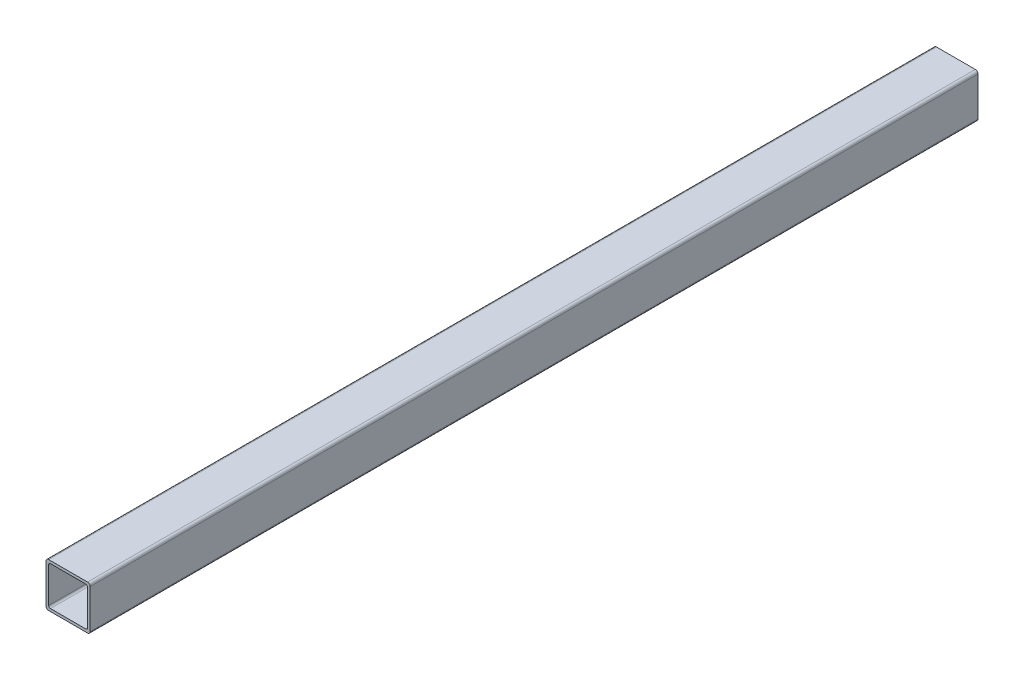
ISO-10303-21;
HEADER;
FILE_DESCRIPTION(('STEP AP214'),'2;1');
FILE_NAME('part.step','',(''),(''),'','','');
FILE_SCHEMA(('AUTOMOTIVE_DESIGN { 1 0 10303 214 1 1 1 1 }'));
ENDSEC;
DATA;
#1=APPLICATION_CONTEXT('core data for automotive mechanical design processes');
#2=APPLICATION_PROTOCOL_DEFINITION('international standard','automotive_design',2000,#1);
#3=PRODUCT_CONTEXT('',#1,'mechanical');
#4=PRODUCT('Part','Part','',(#3));
#5=PRODUCT_RELATED_PRODUCT_CATEGORY('part','',(#4));
#6=PRODUCT_DEFINITION_FORMATION('','',#4);
#7=PRODUCT_DEFINITION_CONTEXT('part definition',#1,'design');
#8=PRODUCT_DEFINITION('design','',#6,#7);
#9=PRODUCT_DEFINITION_SHAPE('','',#8);
#10=(LENGTH_UNIT() NAMED_UNIT(*) SI_UNIT(.MILLI.,.METRE.));
#11=(NAMED_UNIT(*) PLANE_ANGLE_UNIT() SI_UNIT($,.RADIAN.));
#12=(NAMED_UNIT(*) SI_UNIT($,.STERADIAN.) SOLID_ANGLE_UNIT());
#13=UNCERTAINTY_MEASURE_WITH_UNIT(LENGTH_MEASURE(1.E-05),#10,'distance_accuracy_value','');
#14=(GEOMETRIC_REPRESENTATION_CONTEXT(3) GLOBAL_UNCERTAINTY_ASSIGNED_CONTEXT((#13)) GLOBAL_UNIT_ASSIGNED_CONTEXT((#10,
#11,#12)) REPRESENTATION_CONTEXT('',''));
#15=CARTESIAN_POINT('',(0.,0.,0.));
#16=DIRECTION('',(0.,0.,1.));
#17=DIRECTION('',(1.,0.,0.));
#18=AXIS2_PLACEMENT_3D('',#15,#16,#17);
#19=CARTESIAN_POINT('',(-47.,-50.,-1075.71067811867));
#20=DIRECTION('',(0.,-1.,0.));
#21=DIRECTION('',(0.,0.,-1.));
#22=AXIS2_PLACEMENT_3D('',#19,#20,#21);
#23=PLANE('',#22);
#24=DIRECTION('',(-1.,0.,0.));
#25=VECTOR('',#24,1.);
#26=CARTESIAN_POINT('',(-47.,-50.,-1005.00000000002));
#27=LINE('',#26,#25);
#28=CARTESIAN_POINT('',(-3.00000000000004,-50.,-1005.00000000002));
#29=VERTEX_POINT('',#28);
#30=CARTESIAN_POINT('',(-47.,-50.,-1005.00000000002));
#31=VERTEX_POINT('',#30);
#32=EDGE_CURVE('E11',#29,#31,#27,.T.);
#33=ORIENTED_EDGE('',*,*,#32,.F.);
#34=DIRECTION('',(0.,0.,1.));
#35=VECTOR('',#34,1.);
#36=CARTESIAN_POINT('',(-3.00000000000004,-50.,-1075.71067811867));
#37=LINE('',#36,#35);
#38=CARTESIAN_POINT('',(-3.00000000000004,-50.,0.));
#39=VERTEX_POINT('',#38);
#40=EDGE_CURVE('E234',#29,#39,#37,.T.);
#41=ORIENTED_EDGE('',*,*,#40,.T.);
#42=DIRECTION('',(1.,0.,0.));
#43=VECTOR('',#42,1.);
#44=CARTESIAN_POINT('',(-47.,-50.,0.));
#45=LINE('',#44,#43);
#46=CARTESIAN_POINT('',(-47.,-50.,0.));
#47=VERTEX_POINT('',#46);
#48=EDGE_CURVE('E200',#47,#39,#45,.T.);
#49=ORIENTED_EDGE('',*,*,#48,.F.);
#50=DIRECTION('',(0.,0.,1.));
#51=VECTOR('',#50,1.);
#52=CARTESIAN_POINT('',(-47.,-50.,-1075.71067811867));
#53=LINE('',#52,#51);
#54=EDGE_CURVE('E221',#31,#47,#53,.T.);
#55=ORIENTED_EDGE('',*,*,#54,.F.);
#56=EDGE_LOOP('',(#33,#41,#49,#55));
#57=FACE_BOUND('',#56,.T.);
#58=ADVANCED_FACE('F35',(#57),#23,.T.);
#59=CARTESIAN_POINT('',(-3.00000000000004,-47.,-1075.71067811867));
#60=DIRECTION('',(0.,0.,1.));
#61=DIRECTION('',(1.,0.,0.));
#62=AXIS2_PLACEMENT_3D('',#59,#60,#61);
#63=CYLINDRICAL_SURFACE('',#62,3.);
#64=CARTESIAN_POINT('',(-3.00000000000004,-47.,-1005.00000000002));
#65=DIRECTION('',(0.,0.,1.));
#66=DIRECTION('',(1.,0.,0.));
#67=AXIS2_PLACEMENT_3D('',#64,#65,#66);
#68=CIRCLE('',#67,3.);
#69=CARTESIAN_POINT('',(0.,-47.,-1005.00000000002));
#70=VERTEX_POINT('',#69);
#71=EDGE_CURVE('E301',#70,#29,#68,.F.);
#72=ORIENTED_EDGE('',*,*,#71,.F.);
#73=DIRECTION('',(0.,0.,1.));
#74=VECTOR('',#73,1.);
#75=CARTESIAN_POINT('',(0.,-47.,-1075.71067811867));
#76=LINE('',#75,#74);
#77=CARTESIAN_POINT('',(0.,-47.,0.));
#78=VERTEX_POINT('',#77);
#79=EDGE_CURVE('E232',#70,#78,#76,.T.);
#80=ORIENTED_EDGE('',*,*,#79,.T.);
#81=CARTESIAN_POINT('',(-3.00000000000004,-47.,0.));
#82=DIRECTION('',(0.,0.,1.));
#83=DIRECTION('',(1.,0.,0.));
#84=AXIS2_PLACEMENT_3D('',#81,#82,#83);
#85=CIRCLE('',#84,3.);
#86=EDGE_CURVE('E203',#39,#78,#85,.T.);
#87=ORIENTED_EDGE('',*,*,#86,.F.);
#88=ORIENTED_EDGE('',*,*,#40,.F.);
#89=EDGE_LOOP('',(#72,#80,#87,#88));
#90=FACE_BOUND('',#89,.T.);
#91=ADVANCED_FACE('F325',(#90),#63,.T.);
#92=CARTESIAN_POINT('',(0.,-3.00000000000004,-1075.71067811867));
#93=DIRECTION('',(1.,0.,0.));
#94=DIRECTION('',(0.,0.,-1.));
#95=AXIS2_PLACEMENT_3D('',#92,#93,#94);
#96=PLANE('',#95);
#97=DIRECTION('',(0.,-1.,0.));
#98=VECTOR('',#97,1.);
#99=CARTESIAN_POINT('',(0.,-3.00000000000004,-1005.00000000002));
#100=LINE('',#99,#98);
#101=CARTESIAN_POINT('',(0.,-3.00000000000004,-1005.00000000002));
#102=VERTEX_POINT('',#101);
#103=EDGE_CURVE('E303',#102,#70,#100,.T.);
#104=ORIENTED_EDGE('',*,*,#103,.F.);
#105=DIRECTION('',(0.,0.,1.));
#106=VECTOR('',#105,1.);
#107=CARTESIAN_POINT('',(0.,-3.00000000000004,-1075.71067811867));
#108=LINE('',#107,#106);
#109=CARTESIAN_POINT('',(0.,-3.00000000000004,0.));
#110=VERTEX_POINT('',#109);
#111=EDGE_CURVE('E230',#102,#110,#108,.T.);
#112=ORIENTED_EDGE('',*,*,#111,.T.);
#113=DIRECTION('',(0.,1.,0.));
#114=VECTOR('',#113,1.);
#115=CARTESIAN_POINT('',(0.,-3.00000000000004,0.));
#116=LINE('',#115,#114);
#117=EDGE_CURVE('E206',#78,#110,#116,.T.);
#118=ORIENTED_EDGE('',*,*,#117,.F.);
#119=ORIENTED_EDGE('',*,*,#79,.F.);
#120=EDGE_LOOP('',(#104,#112,#118,#119));
#121=FACE_BOUND('',#120,.T.);
#122=ADVANCED_FACE('F322',(#121),#96,.T.);
#123=CARTESIAN_POINT('',(-3.00000000000004,-3.00000000000004,-1075.71067811867));
#124=DIRECTION('',(0.,0.,1.));
#125=DIRECTION('',(1.,0.,0.));
#126=AXIS2_PLACEMENT_3D('',#123,#124,#125);
#127=CYLINDRICAL_SURFACE('',#126,3.00000000000001);
#128=CARTESIAN_POINT('',(-3.00000000000004,-3.00000000000004,-1005.00000000002));
#129=DIRECTION('',(0.,0.,1.));
#130=DIRECTION('',(1.,0.,0.));
#131=AXIS2_PLACEMENT_3D('',#128,#129,#130);
#132=CIRCLE('',#131,3.00000000000001);
#133=CARTESIAN_POINT('',(-3.00000000000004,0.,-1005.00000000002));
#134=VERTEX_POINT('',#133);
#135=EDGE_CURVE('E305',#134,#102,#132,.F.);
#136=ORIENTED_EDGE('',*,*,#135,.F.);
#137=DIRECTION('',(0.,0.,1.));
#138=VECTOR('',#137,1.);
#139=CARTESIAN_POINT('',(-3.00000000000004,0.,-1075.71067811867));
#140=LINE('',#139,#138);
#141=CARTESIAN_POINT('',(-3.00000000000004,0.,0.));
#142=VERTEX_POINT('',#141);
#143=EDGE_CURVE('E228',#134,#142,#140,.T.);
#144=ORIENTED_EDGE('',*,*,#143,.T.);
#145=CARTESIAN_POINT('',(-3.00000000000004,-3.00000000000004,0.));
#146=DIRECTION('',(0.,0.,1.));
#147=DIRECTION('',(-1.,0.,0.));
#148=AXIS2_PLACEMENT_3D('',#145,#146,#147);
#149=CIRCLE('',#148,3.00000000000001);
#150=EDGE_CURVE('E209',#110,#142,#149,.T.);
#151=ORIENTED_EDGE('',*,*,#150,.F.);
#152=ORIENTED_EDGE('',*,*,#111,.F.);
#153=EDGE_LOOP('',(#136,#144,#151,#152));
#154=FACE_BOUND('',#153,.T.);
#155=ADVANCED_FACE('F315',(#154),#127,.T.);
#156=CARTESIAN_POINT('',(-47.0000000000001,0.,-1075.71067811867));
#157=DIRECTION('',(0.,1.,0.));
#158=DIRECTION('',(-1.,0.,0.));
#159=AXIS2_PLACEMENT_3D('',#156,#157,#158);
#160=PLANE('',#159);
#161=DIRECTION('',(1.,0.,0.));
#162=VECTOR('',#161,1.);
#163=CARTESIAN_POINT('',(-47.0000000000001,0.,-1005.00000000002));
#164=LINE('',#163,#162);
#165=CARTESIAN_POINT('',(-47.0000000000001,0.,-1005.00000000002));
#166=VERTEX_POINT('',#165);
#167=EDGE_CURVE('E259',#166,#134,#164,.T.);
#168=ORIENTED_EDGE('',*,*,#167,.F.);
#169=DIRECTION('',(0.,0.,1.));
#170=VECTOR('',#169,1.);
#171=CARTESIAN_POINT('',(-47.0000000000001,0.,-1075.71067811867));
#172=LINE('',#171,#170);
#173=CARTESIAN_POINT('',(-47.0000000000001,0.,0.));
#174=VERTEX_POINT('',#173);
#175=EDGE_CURVE('E226',#166,#174,#172,.T.);
#176=ORIENTED_EDGE('',*,*,#175,.T.);
#177=DIRECTION('',(-1.,0.,0.));
#178=VECTOR('',#177,1.);
#179=CARTESIAN_POINT('',(-47.0000000000001,0.,0.));
#180=LINE('',#179,#178);
#181=EDGE_CURVE('E212',#142,#174,#180,.T.);
#182=ORIENTED_EDGE('',*,*,#181,.F.);
#183=ORIENTED_EDGE('',*,*,#143,.F.);
#184=EDGE_LOOP('',(#168,#176,#182,#183));
#185=FACE_BOUND('',#184,.T.);
#186=ADVANCED_FACE('F318',(#185),#160,.T.);
#187=CARTESIAN_POINT('',(-47.0000000000001,-3.00000000000004,-1075.71067811867));
#188=DIRECTION('',(0.,0.,1.));
#189=DIRECTION('',(1.,0.,0.));
#190=AXIS2_PLACEMENT_3D('',#187,#188,#189);
#191=CYLINDRICAL_SURFACE('',#190,3.);
#192=CARTESIAN_POINT('',(-47.0000000000001,-3.00000000000004,-1005.00000000002));
#193=DIRECTION('',(0.,0.,1.));
#194=DIRECTION('',(1.,0.,0.));
#195=AXIS2_PLACEMENT_3D('',#192,#193,#194);
#196=CIRCLE('',#195,3.);
#197=CARTESIAN_POINT('',(-50.0000000000001,-3.00000000000004,-1005.00000000002));
#198=VERTEX_POINT('',#197);
#199=EDGE_CURVE('E255',#198,#166,#196,.F.);
#200=ORIENTED_EDGE('',*,*,#199,.F.);
#201=DIRECTION('',(0.,0.,1.));
#202=VECTOR('',#201,1.);
#203=CARTESIAN_POINT('',(-50.,-3.00000000000004,-1075.71067811867));
#204=LINE('',#203,#202);
#205=CARTESIAN_POINT('',(-50.,-3.00000000000004,0.));
#206=VERTEX_POINT('',#205);
#207=EDGE_CURVE('E224',#198,#206,#204,.T.);
#208=ORIENTED_EDGE('',*,*,#207,.T.);
#209=CARTESIAN_POINT('',(-47.0000000000001,-3.00000000000004,0.));
#210=DIRECTION('',(0.,0.,1.));
#211=DIRECTION('',(1.,0.,0.));
#212=AXIS2_PLACEMENT_3D('',#209,#210,#211);
#213=CIRCLE('',#212,3.);
#214=EDGE_CURVE('E215',#174,#206,#213,.T.);
#215=ORIENTED_EDGE('',*,*,#214,.F.);
#216=ORIENTED_EDGE('',*,*,#175,.F.);
#217=EDGE_LOOP('',(#200,#208,#215,#216));
#218=FACE_BOUND('',#217,.T.);
#219=ADVANCED_FACE('F338',(#218),#191,.T.);
#220=CARTESIAN_POINT('',(-50.,-3.00000000000004,-1075.71067811867));
#221=DIRECTION('',(-1.,0.,0.));
#222=DIRECTION('',(0.,0.,1.));
#223=AXIS2_PLACEMENT_3D('',#220,#221,#222);
#224=PLANE('',#223);
#225=DIRECTION('',(0.,1.,0.));
#226=VECTOR('',#225,1.);
#227=CARTESIAN_POINT('',(-50.,-3.00000000000004,-1005.00000000002));
#228=LINE('',#227,#226);
#229=CARTESIAN_POINT('',(-50.,-47.,-1005.00000000002));
#230=VERTEX_POINT('',#229);
#231=EDGE_CURVE('E252',#230,#198,#228,.T.);
#232=ORIENTED_EDGE('',*,*,#231,.F.);
#233=DIRECTION('',(0.,0.,1.));
#234=VECTOR('',#233,1.);
#235=CARTESIAN_POINT('',(-50.,-47.,-1075.71067811867));
#236=LINE('',#235,#234);
#237=CARTESIAN_POINT('',(-50.,-47.,0.));
#238=VERTEX_POINT('',#237);
#239=EDGE_CURVE('E222',#230,#238,#236,.T.);
#240=ORIENTED_EDGE('',*,*,#239,.T.);
#241=DIRECTION('',(0.,-1.,0.));
#242=VECTOR('',#241,1.);
#243=CARTESIAN_POINT('',(-50.,-3.00000000000004,0.));
#244=LINE('',#243,#242);
#245=EDGE_CURVE('E218',#206,#238,#244,.T.);
#246=ORIENTED_EDGE('',*,*,#245,.F.);
#247=ORIENTED_EDGE('',*,*,#207,.F.);
#248=EDGE_LOOP('',(#232,#240,#246,#247));
#249=FACE_BOUND('',#248,.T.);
#250=ADVANCED_FACE('F251',(#249),#224,.T.);
#251=CARTESIAN_POINT('',(-47.,-47.,-1075.71067811867));
#252=DIRECTION('',(0.,0.,1.));
#253=DIRECTION('',(1.,0.,0.));
#254=AXIS2_PLACEMENT_3D('',#251,#252,#253);
#255=CYLINDRICAL_SURFACE('',#254,3.);
#256=CARTESIAN_POINT('',(-47.,-47.,-1005.00000000002));
#257=DIRECTION('',(0.,0.,1.));
#258=DIRECTION('',(1.,0.,0.));
#259=AXIS2_PLACEMENT_3D('',#256,#257,#258);
#260=CIRCLE('',#259,3.);
#261=EDGE_CURVE('E241',#31,#230,#260,.F.);
#262=ORIENTED_EDGE('',*,*,#261,.F.);
#263=ORIENTED_EDGE('',*,*,#54,.T.);
#264=CARTESIAN_POINT('',(-47.,-47.,0.));
#265=DIRECTION('',(0.,0.,1.));
#266=DIRECTION('',(1.,0.,0.));
#267=AXIS2_PLACEMENT_3D('',#264,#265,#266);
#268=CIRCLE('',#267,3.);
#269=EDGE_CURVE('E187',#238,#47,#268,.T.);
#270=ORIENTED_EDGE('',*,*,#269,.F.);
#271=ORIENTED_EDGE('',*,*,#239,.F.);
#272=EDGE_LOOP('',(#262,#263,#270,#271));
#273=FACE_BOUND('',#272,.T.);
#274=ADVANCED_FACE('F37',(#273),#255,.T.);
#275=CARTESIAN_POINT('',(-47.,-47.,0.));
#276=DIRECTION('',(0.,0.,1.));
#277=DIRECTION('',(1.,0.,0.));
#278=AXIS2_PLACEMENT_3D('',#275,#276,#277);
#279=PLANE('',#278);
#280=CARTESIAN_POINT('',(-45.,-45.,0.));
#281=DIRECTION('',(0.,0.,1.));
#282=DIRECTION('',(1.,0.,0.));
#283=AXIS2_PLACEMENT_3D('',#280,#281,#282);
#284=CIRCLE('',#283,2.);
#285=CARTESIAN_POINT('',(-47.,-45.,0.));
#286=VERTEX_POINT('',#285);
#287=CARTESIAN_POINT('',(-45.,-47.,0.));
#288=VERTEX_POINT('',#287);
#289=EDGE_CURVE('E162',#286,#288,#284,.T.);
#290=ORIENTED_EDGE('',*,*,#289,.F.);
#291=DIRECTION('',(0.,-1.,0.));
#292=VECTOR('',#291,1.);
#293=CARTESIAN_POINT('',(-47.,-5.00000000000005,0.));
#294=LINE('',#293,#292);
#295=CARTESIAN_POINT('',(-47.,-5.00000000000005,0.));
#296=VERTEX_POINT('',#295);
#297=EDGE_CURVE('E182',#296,#286,#294,.T.);
#298=ORIENTED_EDGE('',*,*,#297,.F.);
#299=CARTESIAN_POINT('',(-45.,-5.00000000000005,0.));
#300=DIRECTION('',(0.,0.,1.));
#301=DIRECTION('',(1.,0.,0.));
#302=AXIS2_PLACEMENT_3D('',#299,#300,#301);
#303=CIRCLE('',#302,2.);
#304=CARTESIAN_POINT('',(-45.,-3.00000000000004,0.));
#305=VERTEX_POINT('',#304);
#306=EDGE_CURVE('E179',#305,#296,#303,.T.);
#307=ORIENTED_EDGE('',*,*,#306,.F.);
#308=DIRECTION('',(-1.,0.,0.));
#309=VECTOR('',#308,1.);
#310=CARTESIAN_POINT('',(-45.,-3.00000000000004,0.));
#311=LINE('',#310,#309);
#312=CARTESIAN_POINT('',(-5.00000000000005,-3.00000000000004,0.));
#313=VERTEX_POINT('',#312);
#314=EDGE_CURVE('E176',#313,#305,#311,.T.);
#315=ORIENTED_EDGE('',*,*,#314,.F.);
#316=CARTESIAN_POINT('',(-5.00000000000005,-5.00000000000005,0.));
#317=DIRECTION('',(0.,0.,1.));
#318=DIRECTION('',(-1.,0.,0.));
#319=AXIS2_PLACEMENT_3D('',#316,#317,#318);
#320=CIRCLE('',#319,2.);
#321=CARTESIAN_POINT('',(-3.00000000000004,-5.00000000000005,0.));
#322=VERTEX_POINT('',#321);
#323=EDGE_CURVE('E170',#322,#313,#320,.T.);
#324=ORIENTED_EDGE('',*,*,#323,.F.);
#325=DIRECTION('',(0.,1.,0.));
#326=VECTOR('',#325,1.);
#327=CARTESIAN_POINT('',(-3.00000000000004,-5.00000000000005,0.));
#328=LINE('',#327,#326);
#329=CARTESIAN_POINT('',(-3.00000000000004,-45.,0.));
#330=VERTEX_POINT('',#329);
#331=EDGE_CURVE('E168',#330,#322,#328,.T.);
#332=ORIENTED_EDGE('',*,*,#331,.F.);
#333=CARTESIAN_POINT('',(-5.00000000000005,-45.,0.));
#334=DIRECTION('',(0.,0.,1.));
#335=DIRECTION('',(1.,0.,0.));
#336=AXIS2_PLACEMENT_3D('',#333,#334,#335);
#337=CIRCLE('',#336,2.);
#338=CARTESIAN_POINT('',(-5.00000000000005,-47.,0.));
#339=VERTEX_POINT('',#338);
#340=EDGE_CURVE('E149',#339,#330,#337,.T.);
#341=ORIENTED_EDGE('',*,*,#340,.F.);
#342=DIRECTION('',(1.,0.,0.));
#343=VECTOR('',#342,1.);
#344=CARTESIAN_POINT('',(-45.,-47.,0.));
#345=LINE('',#344,#343);
#346=EDGE_CURVE('E156',#288,#339,#345,.T.);
#347=ORIENTED_EDGE('',*,*,#346,.F.);
#348=EDGE_LOOP('',(#290,#298,#307,#315,#324,#332,#341,#347));
#349=FACE_BOUND('',#348,.T.);
#350=ORIENTED_EDGE('',*,*,#269,.T.);
#351=ORIENTED_EDGE('',*,*,#48,.T.);
#352=ORIENTED_EDGE('',*,*,#86,.T.);
#353=ORIENTED_EDGE('',*,*,#117,.T.);
#354=ORIENTED_EDGE('',*,*,#150,.T.);
#355=ORIENTED_EDGE('',*,*,#181,.T.);
#356=ORIENTED_EDGE('',*,*,#214,.T.);
#357=ORIENTED_EDGE('',*,*,#245,.T.);
#358=EDGE_LOOP('',(#350,#351,#352,#353,#354,#355,#356,#357));
#359=FACE_BOUND('',#358,.T.);
#360=ADVANCED_FACE('F164',(#349,#359),#279,.T.);
#361=CARTESIAN_POINT('',(-45.,-47.,-1075.71067811867));
#362=DIRECTION('',(0.,-1.,0.));
#363=DIRECTION('',(0.,0.,-1.));
#364=AXIS2_PLACEMENT_3D('',#361,#362,#363);
#365=PLANE('',#364);
#366=DIRECTION('',(0.,0.,1.));
#367=VECTOR('',#366,1.);
#368=CARTESIAN_POINT('',(-5.00000000000005,-47.,-1075.71067811867));
#369=LINE('',#368,#367);
#370=CARTESIAN_POINT('',(-5.00000000000005,-47.,-1005.00000000002));
#371=VERTEX_POINT('',#370);
#372=EDGE_CURVE('E145',#371,#339,#369,.T.);
#373=ORIENTED_EDGE('',*,*,#372,.F.);
#374=DIRECTION('',(-1.,0.,0.));
#375=VECTOR('',#374,1.);
#376=CARTESIAN_POINT('',(-45.,-47.,-1005.00000000002));
#377=LINE('',#376,#375);
#378=CARTESIAN_POINT('',(-45.,-47.,-1005.00000000002));
#379=VERTEX_POINT('',#378);
#380=EDGE_CURVE('E39',#371,#379,#377,.T.);
#381=ORIENTED_EDGE('',*,*,#380,.T.);
#382=DIRECTION('',(0.,0.,1.));
#383=VECTOR('',#382,1.);
#384=CARTESIAN_POINT('',(-45.,-47.,-1075.71067811867));
#385=LINE('',#384,#383);
#386=EDGE_CURVE('E153',#379,#288,#385,.T.);
#387=ORIENTED_EDGE('',*,*,#386,.T.);
#388=ORIENTED_EDGE('',*,*,#346,.T.);
#389=EDGE_LOOP('',(#373,#381,#387,#388));
#390=FACE_BOUND('',#389,.T.);
#391=ADVANCED_FACE('F157',(#390),#365,.F.);
#392=CARTESIAN_POINT('',(-5.00000000000005,-45.,-1075.71067811867));
#393=DIRECTION('',(0.,0.,1.));
#394=DIRECTION('',(1.,0.,0.));
#395=AXIS2_PLACEMENT_3D('',#392,#393,#394);
#396=CYLINDRICAL_SURFACE('',#395,2.);
#397=DIRECTION('',(0.,0.,1.));
#398=VECTOR('',#397,1.);
#399=CARTESIAN_POINT('',(-3.00000000000004,-45.,-1075.71067811867));
#400=LINE('',#399,#398);
#401=CARTESIAN_POINT('',(-3.00000000000004,-45.,-1005.00000000002));
#402=VERTEX_POINT('',#401);
#403=EDGE_CURVE('E152',#402,#330,#400,.T.);
#404=ORIENTED_EDGE('',*,*,#403,.F.);
#405=CARTESIAN_POINT('',(-5.00000000000005,-45.,-1005.00000000002));
#406=DIRECTION('',(0.,0.,1.));
#407=DIRECTION('',(1.,0.,0.));
#408=AXIS2_PLACEMENT_3D('',#405,#406,#407);
#409=CIRCLE('',#408,2.);
#410=EDGE_CURVE('E44',#402,#371,#409,.F.);
#411=ORIENTED_EDGE('',*,*,#410,.T.);
#412=ORIENTED_EDGE('',*,*,#372,.T.);
#413=ORIENTED_EDGE('',*,*,#340,.T.);
#414=EDGE_LOOP('',(#404,#411,#412,#413));
#415=FACE_BOUND('',#414,.T.);
#416=ADVANCED_FACE('F147',(#415),#396,.F.);
#417=CARTESIAN_POINT('',(-3.00000000000004,-5.00000000000005,-1075.71067811867));
#418=DIRECTION('',(1.,0.,0.));
#419=DIRECTION('',(0.,0.,-1.));
#420=AXIS2_PLACEMENT_3D('',#417,#418,#419);
#421=PLANE('',#420);
#422=DIRECTION('',(0.,0.,1.));
#423=VECTOR('',#422,1.);
#424=CARTESIAN_POINT('',(-3.00000000000004,-5.00000000000005,-1075.71067811867));
#425=LINE('',#424,#423);
#426=CARTESIAN_POINT('',(-3.00000000000004,-5.00000000000005,-1005.00000000002));
#427=VERTEX_POINT('',#426);
#428=EDGE_CURVE('E194',#427,#322,#425,.T.);
#429=ORIENTED_EDGE('',*,*,#428,.F.);
#430=DIRECTION('',(0.,-1.,0.));
#431=VECTOR('',#430,1.);
#432=CARTESIAN_POINT('',(-3.00000000000004,-5.00000000000005,-1005.00000000002));
#433=LINE('',#432,#431);
#434=EDGE_CURVE('E291',#427,#402,#433,.T.);
#435=ORIENTED_EDGE('',*,*,#434,.T.);
#436=ORIENTED_EDGE('',*,*,#403,.T.);
#437=ORIENTED_EDGE('',*,*,#331,.T.);
#438=EDGE_LOOP('',(#429,#435,#436,#437));
#439=FACE_BOUND('',#438,.T.);
#440=ADVANCED_FACE('F290',(#439),#421,.F.);
#441=CARTESIAN_POINT('',(-5.00000000000005,-5.00000000000005,-1075.71067811867));
#442=DIRECTION('',(0.,0.,1.));
#443=DIRECTION('',(1.,0.,0.));
#444=AXIS2_PLACEMENT_3D('',#441,#442,#443);
#445=CYLINDRICAL_SURFACE('',#444,2.);
#446=DIRECTION('',(0.,0.,1.));
#447=VECTOR('',#446,1.);
#448=CARTESIAN_POINT('',(-5.00000000000005,-3.00000000000004,-1075.71067811867));
#449=LINE('',#448,#447);
#450=CARTESIAN_POINT('',(-5.00000000000005,-3.00000000000004,-1005.00000000002));
#451=VERTEX_POINT('',#450);
#452=EDGE_CURVE('E192',#451,#313,#449,.T.);
#453=ORIENTED_EDGE('',*,*,#452,.F.);
#454=CARTESIAN_POINT('',(-5.00000000000005,-5.00000000000005,-1005.00000000002));
#455=DIRECTION('',(0.,0.,1.));
#456=DIRECTION('',(1.,0.,0.));
#457=AXIS2_PLACEMENT_3D('',#454,#455,#456);
#458=CIRCLE('',#457,2.);
#459=EDGE_CURVE('E287',#451,#427,#458,.F.);
#460=ORIENTED_EDGE('',*,*,#459,.T.);
#461=ORIENTED_EDGE('',*,*,#428,.T.);
#462=ORIENTED_EDGE('',*,*,#323,.T.);
#463=EDGE_LOOP('',(#453,#460,#461,#462));
#464=FACE_BOUND('',#463,.T.);
#465=ADVANCED_FACE('F284',(#464),#445,.F.);
#466=CARTESIAN_POINT('',(-45.,-3.00000000000004,-1075.71067811867));
#467=DIRECTION('',(0.,1.,0.));
#468=DIRECTION('',(0.,0.,1.));
#469=AXIS2_PLACEMENT_3D('',#466,#467,#468);
#470=PLANE('',#469);
#471=DIRECTION('',(0.,0.,1.));
#472=VECTOR('',#471,1.);
#473=CARTESIAN_POINT('',(-45.,-3.00000000000004,-1075.71067811867));
#474=LINE('',#473,#472);
#475=CARTESIAN_POINT('',(-45.,-3.00000000000004,-1005.00000000002));
#476=VERTEX_POINT('',#475);
#477=EDGE_CURVE('E190',#476,#305,#474,.T.);
#478=ORIENTED_EDGE('',*,*,#477,.F.);
#479=DIRECTION('',(1.,0.,0.));
#480=VECTOR('',#479,1.);
#481=CARTESIAN_POINT('',(-45.,-3.00000000000004,-1005.00000000002));
#482=LINE('',#481,#480);
#483=EDGE_CURVE('E294',#476,#451,#482,.T.);
#484=ORIENTED_EDGE('',*,*,#483,.T.);
#485=ORIENTED_EDGE('',*,*,#452,.T.);
#486=ORIENTED_EDGE('',*,*,#314,.T.);
#487=EDGE_LOOP('',(#478,#484,#485,#486));
#488=FACE_BOUND('',#487,.T.);
#489=ADVANCED_FACE('F281',(#488),#470,.F.);
#490=CARTESIAN_POINT('',(-45.,-5.00000000000005,-1075.71067811867));
#491=DIRECTION('',(0.,0.,1.));
#492=DIRECTION('',(1.,0.,0.));
#493=AXIS2_PLACEMENT_3D('',#490,#491,#492);
#494=CYLINDRICAL_SURFACE('',#493,2.);
#495=DIRECTION('',(0.,0.,1.));
#496=VECTOR('',#495,1.);
#497=CARTESIAN_POINT('',(-47.,-5.00000000000005,-1075.71067811867));
#498=LINE('',#497,#496);
#499=CARTESIAN_POINT('',(-47.,-5.00000000000005,-1005.00000000002));
#500=VERTEX_POINT('',#499);
#501=EDGE_CURVE('E188',#500,#296,#498,.T.);
#502=ORIENTED_EDGE('',*,*,#501,.F.);
#503=CARTESIAN_POINT('',(-45.,-5.00000000000005,-1005.00000000002));
#504=DIRECTION('',(0.,0.,1.));
#505=DIRECTION('',(1.,0.,0.));
#506=AXIS2_PLACEMENT_3D('',#503,#504,#505);
#507=CIRCLE('',#506,2.);
#508=EDGE_CURVE('E278',#500,#476,#507,.F.);
#509=ORIENTED_EDGE('',*,*,#508,.T.);
#510=ORIENTED_EDGE('',*,*,#477,.T.);
#511=ORIENTED_EDGE('',*,*,#306,.T.);
#512=EDGE_LOOP('',(#502,#509,#510,#511));
#513=FACE_BOUND('',#512,.T.);
#514=ADVANCED_FACE('F276',(#513),#494,.F.);
#515=CARTESIAN_POINT('',(-47.,-5.00000000000005,-1075.71067811867));
#516=DIRECTION('',(-1.,0.,0.));
#517=DIRECTION('',(0.,0.,1.));
#518=AXIS2_PLACEMENT_3D('',#515,#516,#517);
#519=PLANE('',#518);
#520=DIRECTION('',(0.,0.,1.));
#521=VECTOR('',#520,1.);
#522=CARTESIAN_POINT('',(-47.,-45.,-1075.71067811867));
#523=LINE('',#522,#521);
#524=CARTESIAN_POINT('',(-47.,-45.,-1005.00000000002));
#525=VERTEX_POINT('',#524);
#526=EDGE_CURVE('E185',#525,#286,#523,.T.);
#527=ORIENTED_EDGE('',*,*,#526,.F.);
#528=DIRECTION('',(0.,1.,0.));
#529=VECTOR('',#528,1.);
#530=CARTESIAN_POINT('',(-47.,-5.00000000000005,-1005.00000000002));
#531=LINE('',#530,#529);
#532=EDGE_CURVE('E273',#525,#500,#531,.T.);
#533=ORIENTED_EDGE('',*,*,#532,.T.);
#534=ORIENTED_EDGE('',*,*,#501,.T.);
#535=ORIENTED_EDGE('',*,*,#297,.T.);
#536=EDGE_LOOP('',(#527,#533,#534,#535));
#537=FACE_BOUND('',#536,.T.);
#538=ADVANCED_FACE('F270',(#537),#519,.F.);
#539=CARTESIAN_POINT('',(-45.,-45.,-1075.71067811867));
#540=DIRECTION('',(0.,0.,1.));
#541=DIRECTION('',(1.,0.,0.));
#542=AXIS2_PLACEMENT_3D('',#539,#540,#541);
#543=CYLINDRICAL_SURFACE('',#542,2.);
#544=ORIENTED_EDGE('',*,*,#386,.F.);
#545=CARTESIAN_POINT('',(-45.,-45.,-1005.00000000002));
#546=DIRECTION('',(0.,0.,1.));
#547=DIRECTION('',(1.,0.,0.));
#548=AXIS2_PLACEMENT_3D('',#545,#546,#547);
#549=CIRCLE('',#548,2.);
#550=EDGE_CURVE('E257',#379,#525,#549,.F.);
#551=ORIENTED_EDGE('',*,*,#550,.T.);
#552=ORIENTED_EDGE('',*,*,#526,.T.);
#553=ORIENTED_EDGE('',*,*,#289,.T.);
#554=EDGE_LOOP('',(#544,#551,#552,#553));
#555=FACE_BOUND('',#554,.T.);
#556=ADVANCED_FACE('F263',(#555),#543,.F.);
#557=CARTESIAN_POINT('',(-47.,-50.,-1005.00000000002));
#558=DIRECTION('',(0.,0.,1.));
#559=DIRECTION('',(1.,0.,0.));
#560=AXIS2_PLACEMENT_3D('',#557,#558,#559);
#561=PLANE('',#560);
#562=ORIENTED_EDGE('',*,*,#261,.T.);
#563=ORIENTED_EDGE('',*,*,#231,.T.);
#564=ORIENTED_EDGE('',*,*,#199,.T.);
#565=ORIENTED_EDGE('',*,*,#167,.T.);
#566=ORIENTED_EDGE('',*,*,#135,.T.);
#567=ORIENTED_EDGE('',*,*,#103,.T.);
#568=ORIENTED_EDGE('',*,*,#71,.T.);
#569=ORIENTED_EDGE('',*,*,#32,.T.);
#570=EDGE_LOOP('',(#562,#563,#564,#565,#566,#567,#568,#569));
#571=FACE_BOUND('',#570,.T.);
#572=ORIENTED_EDGE('',*,*,#380,.F.);
#573=ORIENTED_EDGE('',*,*,#410,.F.);
#574=ORIENTED_EDGE('',*,*,#434,.F.);
#575=ORIENTED_EDGE('',*,*,#459,.F.);
#576=ORIENTED_EDGE('',*,*,#483,.F.);
#577=ORIENTED_EDGE('',*,*,#508,.F.);
#578=ORIENTED_EDGE('',*,*,#532,.F.);
#579=ORIENTED_EDGE('',*,*,#550,.F.);
#580=EDGE_LOOP('',(#572,#573,#574,#575,#576,#577,#578,#579));
#581=FACE_BOUND('',#580,.T.);
#582=ADVANCED_FACE('F308',(#571,#581),#561,.F.);
#583=CLOSED_SHELL('',(#58,#91,#122,#155,#186,#219,#250,#274,#360,#391,#416,#440,#465,#489,#514,
#538,#556,#582));
#584=MANIFOLD_SOLID_BREP('B2',#583);
#585=ADVANCED_BREP_SHAPE_REPRESENTATION('',(#18,#584),#14);
#586=SHAPE_DEFINITION_REPRESENTATION(#9,#585);
ENDSEC;
END-ISO-10303-21;
